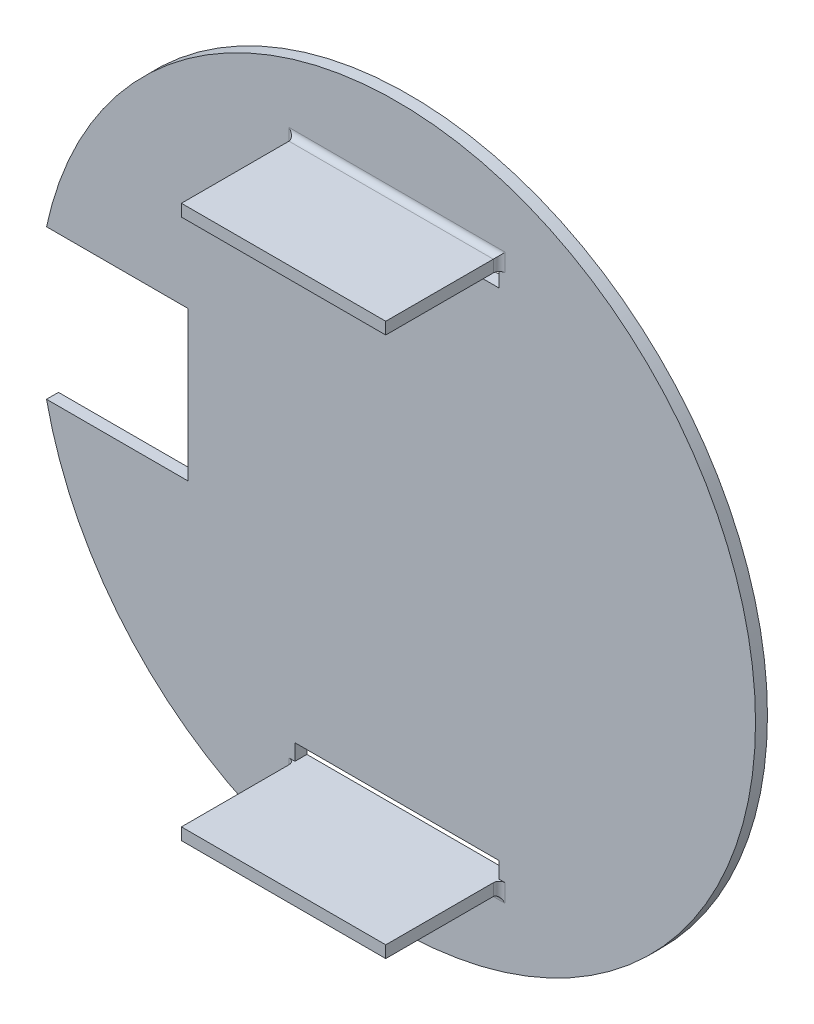
ISO-10303-21;
HEADER;
FILE_DESCRIPTION(('STEP AP214'),'2;1');
FILE_NAME('part.step','',(''),(''),'','','');
FILE_SCHEMA(('AUTOMOTIVE_DESIGN { 1 0 10303 214 1 1 1 1 }'));
ENDSEC;
DATA;
#1=APPLICATION_CONTEXT('core data for automotive mechanical design processes');
#2=APPLICATION_PROTOCOL_DEFINITION('international standard','automotive_design',2000,#1);
#3=PRODUCT_CONTEXT('',#1,'mechanical');
#4=PRODUCT('Part','Part','',(#3));
#5=PRODUCT_RELATED_PRODUCT_CATEGORY('part','',(#4));
#6=PRODUCT_DEFINITION_FORMATION('','',#4);
#7=PRODUCT_DEFINITION_CONTEXT('part definition',#1,'design');
#8=PRODUCT_DEFINITION('design','',#6,#7);
#9=PRODUCT_DEFINITION_SHAPE('','',#8);
#10=(LENGTH_UNIT() NAMED_UNIT(*) SI_UNIT(.MILLI.,.METRE.));
#11=(NAMED_UNIT(*) PLANE_ANGLE_UNIT() SI_UNIT($,.RADIAN.));
#12=(NAMED_UNIT(*) SI_UNIT($,.STERADIAN.) SOLID_ANGLE_UNIT());
#13=UNCERTAINTY_MEASURE_WITH_UNIT(LENGTH_MEASURE(1.E-05),#10,'distance_accuracy_value','');
#14=(GEOMETRIC_REPRESENTATION_CONTEXT(3) GLOBAL_UNCERTAINTY_ASSIGNED_CONTEXT((#13)) GLOBAL_UNIT_ASSIGNED_CONTEXT((#10,
#11,#12)) REPRESENTATION_CONTEXT('',''));
#15=CARTESIAN_POINT('',(0.,0.,0.));
#16=DIRECTION('',(0.,0.,1.));
#17=DIRECTION('',(1.,0.,0.));
#18=AXIS2_PLACEMENT_3D('',#15,#16,#17);
#19=CARTESIAN_POINT('',(0.,0.,2.));
#20=DIRECTION('',(0.,0.,1.));
#21=DIRECTION('',(1.,0.,0.));
#22=AXIS2_PLACEMENT_3D('',#19,#20,#21);
#23=PLANE('',#22);
#24=DIRECTION('',(0.,1.,0.));
#25=VECTOR('',#24,1.);
#26=CARTESIAN_POINT('',(18.1000000000001,0.,2.));
#27=LINE('',#26,#25);
#28=CARTESIAN_POINT('',(18.1,47.2,2.));
#29=VERTEX_POINT('',#28);
#30=CARTESIAN_POINT('',(18.1,44.2,2.));
#31=VERTEX_POINT('',#30);
#32=EDGE_CURVE('E394',#29,#31,#27,.F.);
#33=ORIENTED_EDGE('',*,*,#32,.T.);
#34=DIRECTION('',(-1.,0.,0.));
#35=VECTOR('',#34,1.);
#36=CARTESIAN_POINT('',(-17.1,44.2,2.));
#37=LINE('',#36,#35);
#38=CARTESIAN_POINT('',(17.1,44.2,2.));
#39=VERTEX_POINT('',#38);
#40=EDGE_CURVE('E403',#31,#39,#37,.T.);
#41=ORIENTED_EDGE('',*,*,#40,.T.);
#42=DIRECTION('',(0.,1.,0.));
#43=VECTOR('',#42,1.);
#44=CARTESIAN_POINT('',(17.1,44.2,2.));
#45=LINE('',#44,#43);
#46=CARTESIAN_POINT('',(17.1,41.5,2.));
#47=VERTEX_POINT('',#46);
#48=EDGE_CURVE('E314',#47,#39,#45,.T.);
#49=ORIENTED_EDGE('',*,*,#48,.F.);
#50=DIRECTION('',(1.,0.,0.));
#51=VECTOR('',#50,1.);
#52=CARTESIAN_POINT('',(-17.1,41.5,2.));
#53=LINE('',#52,#51);
#54=CARTESIAN_POINT('',(-17.1,41.5,2.));
#55=VERTEX_POINT('',#54);
#56=EDGE_CURVE('E310',#55,#47,#53,.T.);
#57=ORIENTED_EDGE('',*,*,#56,.F.);
#58=DIRECTION('',(0.,-1.,0.));
#59=VECTOR('',#58,1.);
#60=CARTESIAN_POINT('',(-17.1,44.2,2.));
#61=LINE('',#60,#59);
#62=CARTESIAN_POINT('',(-17.1,44.2,2.));
#63=VERTEX_POINT('',#62);
#64=EDGE_CURVE('E307',#63,#55,#61,.T.);
#65=ORIENTED_EDGE('',*,*,#64,.F.);
#66=DIRECTION('',(-1.,0.,0.));
#67=VECTOR('',#66,1.);
#68=CARTESIAN_POINT('',(-17.1,44.2,2.));
#69=LINE('',#68,#67);
#70=CARTESIAN_POINT('',(-18.1,44.2,2.));
#71=VERTEX_POINT('',#70);
#72=EDGE_CURVE('E57',#63,#71,#69,.T.);
#73=ORIENTED_EDGE('',*,*,#72,.T.);
#74=DIRECTION('',(0.,-1.,0.));
#75=VECTOR('',#74,1.);
#76=CARTESIAN_POINT('',(-18.1,0.,2.));
#77=LINE('',#76,#75);
#78=CARTESIAN_POINT('',(-18.1,47.2,2.));
#79=VERTEX_POINT('',#78);
#80=EDGE_CURVE('E398',#71,#79,#77,.F.);
#81=ORIENTED_EDGE('',*,*,#80,.T.);
#82=DIRECTION('',(-1.,0.,0.));
#83=VECTOR('',#82,1.);
#84=CARTESIAN_POINT('',(0.,47.2,2.));
#85=LINE('',#84,#83);
#86=EDGE_CURVE('E391',#79,#29,#85,.F.);
#87=ORIENTED_EDGE('',*,*,#86,.T.);
#88=EDGE_LOOP('',(#33,#41,#49,#57,#65,#73,#81,#87));
#89=FACE_BOUND('',#88,.T.);
#90=DIRECTION('',(0.,-1.,0.));
#91=VECTOR('',#90,1.);
#92=CARTESIAN_POINT('',(-35.,-12.5,2.));
#93=LINE('',#92,#91);
#94=CARTESIAN_POINT('',(-35.,12.5,2.));
#95=VERTEX_POINT('',#94);
#96=CARTESIAN_POINT('',(-35.,-12.5,2.));
#97=VERTEX_POINT('',#96);
#98=EDGE_CURVE('E346',#95,#97,#93,.T.);
#99=ORIENTED_EDGE('',*,*,#98,.T.);
#100=DIRECTION('',(-1.,0.,0.));
#101=VECTOR('',#100,1.);
#102=CARTESIAN_POINT('',(-58.6834729715275,-12.5,2.));
#103=LINE('',#102,#101);
#104=CARTESIAN_POINT('',(-58.6834729715275,-12.5,2.));
#105=VERTEX_POINT('',#104);
#106=EDGE_CURVE('E350',#97,#105,#103,.T.);
#107=ORIENTED_EDGE('',*,*,#106,.T.);
#108=CARTESIAN_POINT('',(0.,0.,2.));
#109=DIRECTION('',(0.,0.,1.));
#110=DIRECTION('',(1.,0.,0.));
#111=AXIS2_PLACEMENT_3D('',#108,#109,#110);
#112=CIRCLE('',#111,60.);
#113=CARTESIAN_POINT('',(-58.6834729715275,12.5,2.));
#114=VERTEX_POINT('',#113);
#115=EDGE_CURVE('E354',#105,#114,#112,.T.);
#116=ORIENTED_EDGE('',*,*,#115,.T.);
#117=DIRECTION('',(1.,0.,0.));
#118=VECTOR('',#117,1.);
#119=CARTESIAN_POINT('',(-58.6834729715275,12.5,2.));
#120=LINE('',#119,#118);
#121=EDGE_CURVE('E357',#114,#95,#120,.T.);
#122=ORIENTED_EDGE('',*,*,#121,.T.);
#123=EDGE_LOOP('',(#99,#107,#116,#122));
#124=FACE_BOUND('',#123,.T.);
#125=DIRECTION('',(0.,-1.,0.));
#126=VECTOR('',#125,1.);
#127=CARTESIAN_POINT('',(-18.1,0.,2.));
#128=LINE('',#127,#126);
#129=CARTESIAN_POINT('',(-18.1,-47.2,2.));
#130=VERTEX_POINT('',#129);
#131=CARTESIAN_POINT('',(-18.1,-44.2,2.));
#132=VERTEX_POINT('',#131);
#133=EDGE_CURVE('E409',#130,#132,#128,.F.);
#134=ORIENTED_EDGE('',*,*,#133,.T.);
#135=DIRECTION('',(1.,0.,0.));
#136=VECTOR('',#135,1.);
#137=CARTESIAN_POINT('',(-17.1,-44.2,2.));
#138=LINE('',#137,#136);
#139=CARTESIAN_POINT('',(-17.1,-44.2,2.));
#140=VERTEX_POINT('',#139);
#141=EDGE_CURVE('E418',#132,#140,#138,.T.);
#142=ORIENTED_EDGE('',*,*,#141,.T.);
#143=DIRECTION('',(0.,-1.,0.));
#144=VECTOR('',#143,1.);
#145=CARTESIAN_POINT('',(-17.1,-44.2,2.));
#146=LINE('',#145,#144);
#147=CARTESIAN_POINT('',(-17.1,-41.5,2.));
#148=VERTEX_POINT('',#147);
#149=EDGE_CURVE('E266',#148,#140,#146,.T.);
#150=ORIENTED_EDGE('',*,*,#149,.F.);
#151=DIRECTION('',(-1.,0.,0.));
#152=VECTOR('',#151,1.);
#153=CARTESIAN_POINT('',(-17.1,-41.5,2.));
#154=LINE('',#153,#152);
#155=CARTESIAN_POINT('',(17.1,-41.5,2.));
#156=VERTEX_POINT('',#155);
#157=EDGE_CURVE('E275',#156,#148,#154,.T.);
#158=ORIENTED_EDGE('',*,*,#157,.F.);
#159=DIRECTION('',(0.,1.,0.));
#160=VECTOR('',#159,1.);
#161=CARTESIAN_POINT('',(17.1,-44.2,2.));
#162=LINE('',#161,#160);
#163=CARTESIAN_POINT('',(17.1,-44.2,2.));
#164=VERTEX_POINT('',#163);
#165=EDGE_CURVE('E270',#164,#156,#162,.T.);
#166=ORIENTED_EDGE('',*,*,#165,.F.);
#167=DIRECTION('',(1.,0.,0.));
#168=VECTOR('',#167,1.);
#169=CARTESIAN_POINT('',(-17.1,-44.2,2.));
#170=LINE('',#169,#168);
#171=CARTESIAN_POINT('',(18.1,-44.2,2.));
#172=VERTEX_POINT('',#171);
#173=EDGE_CURVE('E65',#164,#172,#170,.T.);
#174=ORIENTED_EDGE('',*,*,#173,.T.);
#175=DIRECTION('',(0.,1.,0.));
#176=VECTOR('',#175,1.);
#177=CARTESIAN_POINT('',(18.1000000000001,0.,2.));
#178=LINE('',#177,#176);
#179=CARTESIAN_POINT('',(18.1,-47.2,2.));
#180=VERTEX_POINT('',#179);
#181=EDGE_CURVE('E413',#172,#180,#178,.F.);
#182=ORIENTED_EDGE('',*,*,#181,.T.);
#183=DIRECTION('',(1.,0.,0.));
#184=VECTOR('',#183,1.);
#185=CARTESIAN_POINT('',(0.,-47.2,2.));
#186=LINE('',#185,#184);
#187=EDGE_CURVE('E406',#180,#130,#186,.F.);
#188=ORIENTED_EDGE('',*,*,#187,.T.);
#189=EDGE_LOOP('',(#134,#142,#150,#158,#166,#174,#182,#188));
#190=FACE_BOUND('',#189,.T.);
#191=ADVANCED_FACE('F39',(#89,#124,#190),#23,.T.);
#192=CARTESIAN_POINT('',(0.,0.,0.));
#193=DIRECTION('',(0.,0.,1.));
#194=DIRECTION('',(1.,0.,0.));
#195=AXIS2_PLACEMENT_3D('',#192,#193,#194);
#196=PLANE('',#195);
#197=DIRECTION('',(0.,-1.,0.));
#198=VECTOR('',#197,1.);
#199=CARTESIAN_POINT('',(-17.1,44.2,0.));
#200=LINE('',#199,#198);
#201=CARTESIAN_POINT('',(-17.1,44.2,0.));
#202=VERTEX_POINT('',#201);
#203=CARTESIAN_POINT('',(-17.1,41.5,0.));
#204=VERTEX_POINT('',#203);
#205=EDGE_CURVE('E306',#202,#204,#200,.T.);
#206=ORIENTED_EDGE('',*,*,#205,.T.);
#207=DIRECTION('',(1.,0.,0.));
#208=VECTOR('',#207,1.);
#209=CARTESIAN_POINT('',(-17.1,41.5,0.));
#210=LINE('',#209,#208);
#211=CARTESIAN_POINT('',(17.1,41.5,0.));
#212=VERTEX_POINT('',#211);
#213=EDGE_CURVE('E322',#204,#212,#210,.T.);
#214=ORIENTED_EDGE('',*,*,#213,.T.);
#215=DIRECTION('',(0.,1.,0.));
#216=VECTOR('',#215,1.);
#217=CARTESIAN_POINT('',(17.1,44.2,0.));
#218=LINE('',#217,#216);
#219=CARTESIAN_POINT('',(17.1,44.2,0.));
#220=VERTEX_POINT('',#219);
#221=EDGE_CURVE('E326',#212,#220,#218,.T.);
#222=ORIENTED_EDGE('',*,*,#221,.T.);
#223=DIRECTION('',(-1.,0.,0.));
#224=VECTOR('',#223,1.);
#225=CARTESIAN_POINT('',(-17.1,44.2,0.));
#226=LINE('',#225,#224);
#227=EDGE_CURVE('E311',#220,#202,#226,.T.);
#228=ORIENTED_EDGE('',*,*,#227,.T.);
#229=EDGE_LOOP('',(#206,#214,#222,#228));
#230=FACE_BOUND('',#229,.T.);
#231=DIRECTION('',(0.,-1.,0.));
#232=VECTOR('',#231,1.);
#233=CARTESIAN_POINT('',(-35.,-12.5,0.));
#234=LINE('',#233,#232);
#235=CARTESIAN_POINT('',(-35.,12.5,0.));
#236=VERTEX_POINT('',#235);
#237=CARTESIAN_POINT('',(-35.,-12.5,0.));
#238=VERTEX_POINT('',#237);
#239=EDGE_CURVE('E345',#236,#238,#234,.T.);
#240=ORIENTED_EDGE('',*,*,#239,.F.);
#241=DIRECTION('',(1.,0.,0.));
#242=VECTOR('',#241,1.);
#243=CARTESIAN_POINT('',(-58.6834729715275,12.5,0.));
#244=LINE('',#243,#242);
#245=CARTESIAN_POINT('',(-58.6834729715275,12.5,0.));
#246=VERTEX_POINT('',#245);
#247=EDGE_CURVE('E351',#246,#236,#244,.T.);
#248=ORIENTED_EDGE('',*,*,#247,.F.);
#249=CARTESIAN_POINT('',(0.,0.,0.));
#250=DIRECTION('',(0.,0.,1.));
#251=DIRECTION('',(1.,0.,0.));
#252=AXIS2_PLACEMENT_3D('',#249,#250,#251);
#253=CIRCLE('',#252,60.);
#254=CARTESIAN_POINT('',(-58.6834729715275,-12.5,0.));
#255=VERTEX_POINT('',#254);
#256=EDGE_CURVE('E367',#255,#246,#253,.T.);
#257=ORIENTED_EDGE('',*,*,#256,.F.);
#258=DIRECTION('',(-1.,0.,0.));
#259=VECTOR('',#258,1.);
#260=CARTESIAN_POINT('',(-58.6834729715275,-12.5,0.));
#261=LINE('',#260,#259);
#262=EDGE_CURVE('E364',#238,#255,#261,.T.);
#263=ORIENTED_EDGE('',*,*,#262,.F.);
#264=EDGE_LOOP('',(#240,#248,#257,#263));
#265=FACE_BOUND('',#264,.T.);
#266=DIRECTION('',(0.,-1.,0.));
#267=VECTOR('',#266,1.);
#268=CARTESIAN_POINT('',(-17.1,-44.2,0.));
#269=LINE('',#268,#267);
#270=CARTESIAN_POINT('',(-17.1,-41.5,0.));
#271=VERTEX_POINT('',#270);
#272=CARTESIAN_POINT('',(-17.1,-44.2,0.));
#273=VERTEX_POINT('',#272);
#274=EDGE_CURVE('E265',#271,#273,#269,.T.);
#275=ORIENTED_EDGE('',*,*,#274,.T.);
#276=DIRECTION('',(1.,0.,0.));
#277=VECTOR('',#276,1.);
#278=CARTESIAN_POINT('',(-17.1,-44.2,0.));
#279=LINE('',#278,#277);
#280=CARTESIAN_POINT('',(17.1,-44.2,0.));
#281=VERTEX_POINT('',#280);
#282=EDGE_CURVE('E282',#273,#281,#279,.T.);
#283=ORIENTED_EDGE('',*,*,#282,.T.);
#284=DIRECTION('',(0.,1.,0.));
#285=VECTOR('',#284,1.);
#286=CARTESIAN_POINT('',(17.1,-44.2,0.));
#287=LINE('',#286,#285);
#288=CARTESIAN_POINT('',(17.1,-41.5,0.));
#289=VERTEX_POINT('',#288);
#290=EDGE_CURVE('E286',#281,#289,#287,.T.);
#291=ORIENTED_EDGE('',*,*,#290,.T.);
#292=DIRECTION('',(-1.,0.,0.));
#293=VECTOR('',#292,1.);
#294=CARTESIAN_POINT('',(-17.1,-41.5,0.));
#295=LINE('',#294,#293);
#296=EDGE_CURVE('E271',#289,#271,#295,.T.);
#297=ORIENTED_EDGE('',*,*,#296,.T.);
#298=EDGE_LOOP('',(#275,#283,#291,#297));
#299=FACE_BOUND('',#298,.T.);
#300=ADVANCED_FACE('F500',(#230,#265,#299),#196,.F.);
#301=CARTESIAN_POINT('',(-35.,-12.5,2.));
#302=DIRECTION('',(1.,0.,0.));
#303=DIRECTION('',(0.,0.,-1.));
#304=AXIS2_PLACEMENT_3D('',#301,#302,#303);
#305=PLANE('',#304);
#306=ORIENTED_EDGE('',*,*,#239,.T.);
#307=DIRECTION('',(0.,0.,-1.));
#308=VECTOR('',#307,1.);
#309=CARTESIAN_POINT('',(-35.,-12.5,2.));
#310=LINE('',#309,#308);
#311=EDGE_CURVE('E383',#97,#238,#310,.T.);
#312=ORIENTED_EDGE('',*,*,#311,.F.);
#313=ORIENTED_EDGE('',*,*,#98,.F.);
#314=DIRECTION('',(0.,0.,-1.));
#315=VECTOR('',#314,1.);
#316=CARTESIAN_POINT('',(-35.,12.5,2.));
#317=LINE('',#316,#315);
#318=EDGE_CURVE('E360',#95,#236,#317,.T.);
#319=ORIENTED_EDGE('',*,*,#318,.T.);
#320=EDGE_LOOP('',(#306,#312,#313,#319));
#321=FACE_BOUND('',#320,.T.);
#322=ADVANCED_FACE('F505',(#321),#305,.F.);
#323=CARTESIAN_POINT('',(-58.6834729715275,-12.5,2.));
#324=DIRECTION('',(0.,-1.,0.));
#325=DIRECTION('',(0.,0.,-1.));
#326=AXIS2_PLACEMENT_3D('',#323,#324,#325);
#327=PLANE('',#326);
#328=ORIENTED_EDGE('',*,*,#262,.T.);
#329=DIRECTION('',(0.,0.,-1.));
#330=VECTOR('',#329,1.);
#331=CARTESIAN_POINT('',(-58.6834729715275,-12.5,2.));
#332=LINE('',#331,#330);
#333=EDGE_CURVE('E379',#105,#255,#332,.T.);
#334=ORIENTED_EDGE('',*,*,#333,.F.);
#335=ORIENTED_EDGE('',*,*,#106,.F.);
#336=ORIENTED_EDGE('',*,*,#311,.T.);
#337=EDGE_LOOP('',(#328,#334,#335,#336));
#338=FACE_BOUND('',#337,.T.);
#339=ADVANCED_FACE('F519',(#338),#327,.F.);
#340=CARTESIAN_POINT('',(0.,0.,2.));
#341=DIRECTION('',(0.,0.,-1.));
#342=DIRECTION('',(-1.,0.,0.));
#343=AXIS2_PLACEMENT_3D('',#340,#341,#342);
#344=CYLINDRICAL_SURFACE('',#343,60.);
#345=ORIENTED_EDGE('',*,*,#256,.T.);
#346=DIRECTION('',(0.,0.,-1.));
#347=VECTOR('',#346,1.);
#348=CARTESIAN_POINT('',(-58.6834729715275,12.5,2.));
#349=LINE('',#348,#347);
#350=EDGE_CURVE('E375',#114,#246,#349,.T.);
#351=ORIENTED_EDGE('',*,*,#350,.F.);
#352=ORIENTED_EDGE('',*,*,#115,.F.);
#353=ORIENTED_EDGE('',*,*,#333,.T.);
#354=EDGE_LOOP('',(#345,#351,#352,#353));
#355=FACE_BOUND('',#354,.T.);
#356=ADVANCED_FACE('F515',(#355),#344,.T.);
#357=CARTESIAN_POINT('',(-58.6834729715275,12.5,2.));
#358=DIRECTION('',(0.,1.,0.));
#359=DIRECTION('',(0.,0.,1.));
#360=AXIS2_PLACEMENT_3D('',#357,#358,#359);
#361=PLANE('',#360);
#362=ORIENTED_EDGE('',*,*,#247,.T.);
#363=ORIENTED_EDGE('',*,*,#318,.F.);
#364=ORIENTED_EDGE('',*,*,#121,.F.);
#365=ORIENTED_EDGE('',*,*,#350,.T.);
#366=EDGE_LOOP('',(#362,#363,#364,#365));
#367=FACE_BOUND('',#366,.T.);
#368=ADVANCED_FACE('F512',(#367),#361,.F.);
#369=CARTESIAN_POINT('',(-17.1,44.2,2.));
#370=DIRECTION('',(1.,0.,0.));
#371=DIRECTION('',(0.,1.,0.));
#372=AXIS2_PLACEMENT_3D('',#369,#370,#371);
#373=PLANE('',#372);
#374=ORIENTED_EDGE('',*,*,#205,.F.);
#375=DIRECTION('',(0.,0.,-1.));
#376=VECTOR('',#375,1.);
#377=CARTESIAN_POINT('',(-17.1,44.2,2.));
#378=LINE('',#377,#376);
#379=EDGE_CURVE('E318',#63,#202,#378,.T.);
#380=ORIENTED_EDGE('',*,*,#379,.F.);
#381=ORIENTED_EDGE('',*,*,#64,.T.);
#382=DIRECTION('',(0.,0.,-1.));
#383=VECTOR('',#382,1.);
#384=CARTESIAN_POINT('',(-17.1,41.5,2.));
#385=LINE('',#384,#383);
#386=EDGE_CURVE('E341',#55,#204,#385,.T.);
#387=ORIENTED_EDGE('',*,*,#386,.T.);
#388=EDGE_LOOP('',(#374,#380,#381,#387));
#389=FACE_BOUND('',#388,.T.);
#390=ADVANCED_FACE('F509',(#389),#373,.T.);
#391=CARTESIAN_POINT('',(-17.1,41.5,2.));
#392=DIRECTION('',(0.,1.,0.));
#393=DIRECTION('',(0.,0.,1.));
#394=AXIS2_PLACEMENT_3D('',#391,#392,#393);
#395=PLANE('',#394);
#396=ORIENTED_EDGE('',*,*,#213,.F.);
#397=ORIENTED_EDGE('',*,*,#386,.F.);
#398=ORIENTED_EDGE('',*,*,#56,.T.);
#399=DIRECTION('',(0.,0.,-1.));
#400=VECTOR('',#399,1.);
#401=CARTESIAN_POINT('',(17.1,41.5,2.));
#402=LINE('',#401,#400);
#403=EDGE_CURVE('E338',#47,#212,#402,.T.);
#404=ORIENTED_EDGE('',*,*,#403,.T.);
#405=EDGE_LOOP('',(#396,#397,#398,#404));
#406=FACE_BOUND('',#405,.T.);
#407=ADVANCED_FACE('F671',(#406),#395,.T.);
#408=CARTESIAN_POINT('',(17.1,44.2,2.));
#409=DIRECTION('',(-1.,0.,0.));
#410=DIRECTION('',(0.,-1.,0.));
#411=AXIS2_PLACEMENT_3D('',#408,#409,#410);
#412=PLANE('',#411);
#413=ORIENTED_EDGE('',*,*,#221,.F.);
#414=ORIENTED_EDGE('',*,*,#403,.F.);
#415=ORIENTED_EDGE('',*,*,#48,.T.);
#416=DIRECTION('',(0.,0.,-1.));
#417=VECTOR('',#416,1.);
#418=CARTESIAN_POINT('',(17.1,44.2,2.));
#419=LINE('',#418,#417);
#420=EDGE_CURVE('E335',#39,#220,#419,.T.);
#421=ORIENTED_EDGE('',*,*,#420,.T.);
#422=EDGE_LOOP('',(#413,#414,#415,#421));
#423=FACE_BOUND('',#422,.T.);
#424=ADVANCED_FACE('F629',(#423),#412,.T.);
#425=CARTESIAN_POINT('',(-17.1,44.2,2.));
#426=DIRECTION('',(0.,-1.,0.));
#427=DIRECTION('',(1.,0.,0.));
#428=AXIS2_PLACEMENT_3D('',#425,#426,#427);
#429=PLANE('',#428);
#430=ORIENTED_EDGE('',*,*,#227,.F.);
#431=ORIENTED_EDGE('',*,*,#420,.F.);
#432=ORIENTED_EDGE('',*,*,#40,.F.);
#433=CARTESIAN_POINT('',(18.1,44.2,3.));
#434=DIRECTION('',(0.,-1.,0.));
#435=DIRECTION('',(1.,0.,0.));
#436=AXIS2_PLACEMENT_3D('',#433,#434,#435);
#437=CIRCLE('',#436,1.);
#438=CARTESIAN_POINT('',(17.1,44.2,3.));
#439=VERTEX_POINT('',#438);
#440=EDGE_CURVE('E11',#31,#439,#437,.F.);
#441=ORIENTED_EDGE('',*,*,#440,.T.);
#442=DIRECTION('',(0.,0.,-1.));
#443=VECTOR('',#442,1.);
#444=CARTESIAN_POINT('',(17.1,44.2,21.));
#445=LINE('',#444,#443);
#446=CARTESIAN_POINT('',(17.1,44.2,21.));
#447=VERTEX_POINT('',#446);
#448=EDGE_CURVE('E257',#447,#439,#445,.T.);
#449=ORIENTED_EDGE('',*,*,#448,.F.);
#450=DIRECTION('',(1.,0.,0.));
#451=VECTOR('',#450,1.);
#452=CARTESIAN_POINT('',(-17.1,44.2,21.));
#453=LINE('',#452,#451);
#454=CARTESIAN_POINT('',(-17.1,44.2,21.));
#455=VERTEX_POINT('',#454);
#456=EDGE_CURVE('E235',#455,#447,#453,.T.);
#457=ORIENTED_EDGE('',*,*,#456,.F.);
#458=DIRECTION('',(0.,0.,-1.));
#459=VECTOR('',#458,1.);
#460=CARTESIAN_POINT('',(-17.1,44.2,21.));
#461=LINE('',#460,#459);
#462=CARTESIAN_POINT('',(-17.1,44.2,3.));
#463=VERTEX_POINT('',#462);
#464=EDGE_CURVE('E261',#455,#463,#461,.T.);
#465=ORIENTED_EDGE('',*,*,#464,.T.);
#466=CARTESIAN_POINT('',(-18.1,44.2,3.));
#467=DIRECTION('',(0.,-1.,0.));
#468=DIRECTION('',(1.,0.,0.));
#469=AXIS2_PLACEMENT_3D('',#466,#467,#468);
#470=CIRCLE('',#469,1.);
#471=EDGE_CURVE('E49',#463,#71,#470,.F.);
#472=ORIENTED_EDGE('',*,*,#471,.T.);
#473=ORIENTED_EDGE('',*,*,#72,.F.);
#474=ORIENTED_EDGE('',*,*,#379,.T.);
#475=EDGE_LOOP('',(#430,#431,#432,#441,#449,#457,#465,#472,#473,#474));
#476=FACE_BOUND('',#475,.T.);
#477=ADVANCED_FACE('F479',(#476),#429,.T.);
#478=CARTESIAN_POINT('',(-17.1,-44.2,2.));
#479=DIRECTION('',(1.,0.,0.));
#480=DIRECTION('',(0.,1.,0.));
#481=AXIS2_PLACEMENT_3D('',#478,#479,#480);
#482=PLANE('',#481);
#483=ORIENTED_EDGE('',*,*,#274,.F.);
#484=DIRECTION('',(0.,0.,-1.));
#485=VECTOR('',#484,1.);
#486=CARTESIAN_POINT('',(-17.1,-41.5,2.));
#487=LINE('',#486,#485);
#488=EDGE_CURVE('E278',#148,#271,#487,.T.);
#489=ORIENTED_EDGE('',*,*,#488,.F.);
#490=ORIENTED_EDGE('',*,*,#149,.T.);
#491=DIRECTION('',(0.,0.,-1.));
#492=VECTOR('',#491,1.);
#493=CARTESIAN_POINT('',(-17.1,-44.2,2.));
#494=LINE('',#493,#492);
#495=EDGE_CURVE('E302',#140,#273,#494,.T.);
#496=ORIENTED_EDGE('',*,*,#495,.T.);
#497=EDGE_LOOP('',(#483,#489,#490,#496));
#498=FACE_BOUND('',#497,.T.);
#499=ADVANCED_FACE('F618',(#498),#482,.T.);
#500=CARTESIAN_POINT('',(-17.1,-44.2,2.));
#501=DIRECTION('',(0.,1.,0.));
#502=DIRECTION('',(-1.,0.,0.));
#503=AXIS2_PLACEMENT_3D('',#500,#501,#502);
#504=PLANE('',#503);
#505=ORIENTED_EDGE('',*,*,#282,.F.);
#506=ORIENTED_EDGE('',*,*,#495,.F.);
#507=ORIENTED_EDGE('',*,*,#141,.F.);
#508=CARTESIAN_POINT('',(-18.1,-44.2,3.));
#509=DIRECTION('',(0.,1.,0.));
#510=DIRECTION('',(-1.,0.,0.));
#511=AXIS2_PLACEMENT_3D('',#508,#509,#510);
#512=CIRCLE('',#511,1.);
#513=CARTESIAN_POINT('',(-17.1,-44.2,3.));
#514=VERTEX_POINT('',#513);
#515=EDGE_CURVE('E228',#132,#514,#512,.F.);
#516=ORIENTED_EDGE('',*,*,#515,.T.);
#517=DIRECTION('',(0.,0.,-1.));
#518=VECTOR('',#517,1.);
#519=CARTESIAN_POINT('',(-17.1,-44.2,21.));
#520=LINE('',#519,#518);
#521=CARTESIAN_POINT('',(-17.1,-44.2,21.));
#522=VERTEX_POINT('',#521);
#523=EDGE_CURVE('E207',#522,#514,#520,.T.);
#524=ORIENTED_EDGE('',*,*,#523,.F.);
#525=DIRECTION('',(-1.,0.,0.));
#526=VECTOR('',#525,1.);
#527=CARTESIAN_POINT('',(-17.1,-44.2,21.));
#528=LINE('',#527,#526);
#529=CARTESIAN_POINT('',(17.1,-44.2,21.));
#530=VERTEX_POINT('',#529);
#531=EDGE_CURVE('E215',#530,#522,#528,.T.);
#532=ORIENTED_EDGE('',*,*,#531,.F.);
#533=DIRECTION('',(0.,0.,-1.));
#534=VECTOR('',#533,1.);
#535=CARTESIAN_POINT('',(17.1,-44.2,21.));
#536=LINE('',#535,#534);
#537=CARTESIAN_POINT('',(17.1,-44.2,3.));
#538=VERTEX_POINT('',#537);
#539=EDGE_CURVE('E745',#530,#538,#536,.T.);
#540=ORIENTED_EDGE('',*,*,#539,.T.);
#541=CARTESIAN_POINT('',(18.1,-44.2,3.));
#542=DIRECTION('',(0.,1.,0.));
#543=DIRECTION('',(-1.,0.,0.));
#544=AXIS2_PLACEMENT_3D('',#541,#542,#543);
#545=CIRCLE('',#544,1.);
#546=EDGE_CURVE('E437',#538,#172,#545,.F.);
#547=ORIENTED_EDGE('',*,*,#546,.T.);
#548=ORIENTED_EDGE('',*,*,#173,.F.);
#549=DIRECTION('',(0.,0.,-1.));
#550=VECTOR('',#549,1.);
#551=CARTESIAN_POINT('',(17.1,-44.2,2.));
#552=LINE('',#551,#550);
#553=EDGE_CURVE('E299',#164,#281,#552,.T.);
#554=ORIENTED_EDGE('',*,*,#553,.T.);
#555=EDGE_LOOP('',(#505,#506,#507,#516,#524,#532,#540,#547,#548,#554));
#556=FACE_BOUND('',#555,.T.);
#557=ADVANCED_FACE('F226',(#556),#504,.T.);
#558=CARTESIAN_POINT('',(17.1,-44.2,2.));
#559=DIRECTION('',(-1.,0.,0.));
#560=DIRECTION('',(0.,-1.,0.));
#561=AXIS2_PLACEMENT_3D('',#558,#559,#560);
#562=PLANE('',#561);
#563=ORIENTED_EDGE('',*,*,#290,.F.);
#564=ORIENTED_EDGE('',*,*,#553,.F.);
#565=ORIENTED_EDGE('',*,*,#165,.T.);
#566=DIRECTION('',(0.,0.,-1.));
#567=VECTOR('',#566,1.);
#568=CARTESIAN_POINT('',(17.1,-41.5,2.));
#569=LINE('',#568,#567);
#570=EDGE_CURVE('E296',#156,#289,#569,.T.);
#571=ORIENTED_EDGE('',*,*,#570,.T.);
#572=EDGE_LOOP('',(#563,#564,#565,#571));
#573=FACE_BOUND('',#572,.T.);
#574=ADVANCED_FACE('F617',(#573),#562,.T.);
#575=CARTESIAN_POINT('',(-17.1,-41.5,2.));
#576=DIRECTION('',(0.,-1.,0.));
#577=DIRECTION('',(0.,0.,-1.));
#578=AXIS2_PLACEMENT_3D('',#575,#576,#577);
#579=PLANE('',#578);
#580=ORIENTED_EDGE('',*,*,#296,.F.);
#581=ORIENTED_EDGE('',*,*,#570,.F.);
#582=ORIENTED_EDGE('',*,*,#157,.T.);
#583=ORIENTED_EDGE('',*,*,#488,.T.);
#584=EDGE_LOOP('',(#580,#581,#582,#583));
#585=FACE_BOUND('',#584,.T.);
#586=ADVANCED_FACE('F497',(#585),#579,.T.);
#587=CARTESIAN_POINT('',(-17.1,44.2,21.));
#588=DIRECTION('',(1.,0.,0.));
#589=DIRECTION('',(0.,0.,-1.));
#590=AXIS2_PLACEMENT_3D('',#587,#588,#589);
#591=PLANE('',#590);
#592=DIRECTION('',(0.,0.,-1.));
#593=VECTOR('',#592,1.);
#594=CARTESIAN_POINT('',(-17.1,46.2,21.));
#595=LINE('',#594,#593);
#596=CARTESIAN_POINT('',(-17.1,46.2,21.));
#597=VERTEX_POINT('',#596);
#598=CARTESIAN_POINT('',(-17.1,46.2,3.));
#599=VERTEX_POINT('',#598);
#600=EDGE_CURVE('E249',#597,#599,#595,.T.);
#601=ORIENTED_EDGE('',*,*,#600,.T.);
#602=DIRECTION('',(0.,-1.,0.));
#603=VECTOR('',#602,1.);
#604=CARTESIAN_POINT('',(-17.1,44.2,3.));
#605=LINE('',#604,#603);
#606=EDGE_CURVE('E427',#599,#463,#605,.T.);
#607=ORIENTED_EDGE('',*,*,#606,.T.);
#608=ORIENTED_EDGE('',*,*,#464,.F.);
#609=DIRECTION('',(0.,-1.,0.));
#610=VECTOR('',#609,1.);
#611=CARTESIAN_POINT('',(-17.1,44.2,21.));
#612=LINE('',#611,#610);
#613=EDGE_CURVE('E230',#597,#455,#612,.T.);
#614=ORIENTED_EDGE('',*,*,#613,.F.);
#615=EDGE_LOOP('',(#601,#607,#608,#614));
#616=FACE_BOUND('',#615,.T.);
#617=ADVANCED_FACE('F475',(#616),#591,.F.);
#618=CARTESIAN_POINT('',(17.1,44.2,21.));
#619=DIRECTION('',(-1.,0.,0.));
#620=DIRECTION('',(0.,-1.,0.));
#621=AXIS2_PLACEMENT_3D('',#618,#619,#620);
#622=PLANE('',#621);
#623=ORIENTED_EDGE('',*,*,#448,.T.);
#624=DIRECTION('',(0.,1.,0.));
#625=VECTOR('',#624,1.);
#626=CARTESIAN_POINT('',(17.1,44.2,3.));
#627=LINE('',#626,#625);
#628=CARTESIAN_POINT('',(17.1,46.2,3.));
#629=VERTEX_POINT('',#628);
#630=EDGE_CURVE('E431',#439,#629,#627,.T.);
#631=ORIENTED_EDGE('',*,*,#630,.T.);
#632=DIRECTION('',(0.,0.,-1.));
#633=VECTOR('',#632,1.);
#634=CARTESIAN_POINT('',(17.1,46.2,21.));
#635=LINE('',#634,#633);
#636=CARTESIAN_POINT('',(17.1,46.2,21.));
#637=VERTEX_POINT('',#636);
#638=EDGE_CURVE('E253',#637,#629,#635,.T.);
#639=ORIENTED_EDGE('',*,*,#638,.F.);
#640=DIRECTION('',(0.,1.,0.));
#641=VECTOR('',#640,1.);
#642=CARTESIAN_POINT('',(17.1,44.2,21.));
#643=LINE('',#642,#641);
#644=EDGE_CURVE('E243',#447,#637,#643,.T.);
#645=ORIENTED_EDGE('',*,*,#644,.F.);
#646=EDGE_LOOP('',(#623,#631,#639,#645));
#647=FACE_BOUND('',#646,.T.);
#648=ADVANCED_FACE('F489',(#647),#622,.F.);
#649=CARTESIAN_POINT('',(-17.1,46.2,21.));
#650=DIRECTION('',(0.,-1.,0.));
#651=DIRECTION('',(0.,0.,-1.));
#652=AXIS2_PLACEMENT_3D('',#649,#650,#651);
#653=PLANE('',#652);
#654=ORIENTED_EDGE('',*,*,#638,.T.);
#655=DIRECTION('',(-1.,0.,0.));
#656=VECTOR('',#655,1.);
#657=CARTESIAN_POINT('',(-17.1,46.2,3.));
#658=LINE('',#657,#656);
#659=EDGE_CURVE('E434',#629,#599,#658,.T.);
#660=ORIENTED_EDGE('',*,*,#659,.T.);
#661=ORIENTED_EDGE('',*,*,#600,.F.);
#662=DIRECTION('',(-1.,0.,0.));
#663=VECTOR('',#662,1.);
#664=CARTESIAN_POINT('',(-17.1,46.2,21.));
#665=LINE('',#664,#663);
#666=EDGE_CURVE('E246',#637,#597,#665,.T.);
#667=ORIENTED_EDGE('',*,*,#666,.F.);
#668=EDGE_LOOP('',(#654,#660,#661,#667));
#669=FACE_BOUND('',#668,.T.);
#670=ADVANCED_FACE('F487',(#669),#653,.F.);
#671=CARTESIAN_POINT('',(0.,0.,21.));
#672=DIRECTION('',(0.,0.,-1.));
#673=DIRECTION('',(-1.,0.,0.));
#674=AXIS2_PLACEMENT_3D('',#671,#672,#673);
#675=PLANE('',#674);
#676=ORIENTED_EDGE('',*,*,#613,.T.);
#677=ORIENTED_EDGE('',*,*,#456,.T.);
#678=ORIENTED_EDGE('',*,*,#644,.T.);
#679=ORIENTED_EDGE('',*,*,#666,.T.);
#680=EDGE_LOOP('',(#676,#677,#678,#679));
#681=FACE_BOUND('',#680,.T.);
#682=ADVANCED_FACE('F483',(#681),#675,.F.);
#683=CARTESIAN_POINT('',(-17.1,-44.2,21.));
#684=DIRECTION('',(1.,0.,0.));
#685=DIRECTION('',(0.,0.,-1.));
#686=AXIS2_PLACEMENT_3D('',#683,#684,#685);
#687=PLANE('',#686);
#688=ORIENTED_EDGE('',*,*,#523,.T.);
#689=DIRECTION('',(0.,-1.,0.));
#690=VECTOR('',#689,1.);
#691=CARTESIAN_POINT('',(-17.1,-44.2,3.));
#692=LINE('',#691,#690);
#693=CARTESIAN_POINT('',(-17.1,-46.2,3.));
#694=VERTEX_POINT('',#693);
#695=EDGE_CURVE('E421',#514,#694,#692,.T.);
#696=ORIENTED_EDGE('',*,*,#695,.T.);
#697=DIRECTION('',(0.,0.,-1.));
#698=VECTOR('',#697,1.);
#699=CARTESIAN_POINT('',(-17.1,-46.2,21.));
#700=LINE('',#699,#698);
#701=CARTESIAN_POINT('',(-17.1,-46.2,21.));
#702=VERTEX_POINT('',#701);
#703=EDGE_CURVE('E210',#702,#694,#700,.T.);
#704=ORIENTED_EDGE('',*,*,#703,.F.);
#705=DIRECTION('',(0.,-1.,0.));
#706=VECTOR('',#705,1.);
#707=CARTESIAN_POINT('',(-17.1,-44.2,21.));
#708=LINE('',#707,#706);
#709=EDGE_CURVE('E203',#522,#702,#708,.T.);
#710=ORIENTED_EDGE('',*,*,#709,.F.);
#711=EDGE_LOOP('',(#688,#696,#704,#710));
#712=FACE_BOUND('',#711,.T.);
#713=ADVANCED_FACE('F205',(#712),#687,.F.);
#714=CARTESIAN_POINT('',(-17.1,-46.2,21.));
#715=DIRECTION('',(0.,1.,0.));
#716=DIRECTION('',(0.,0.,1.));
#717=AXIS2_PLACEMENT_3D('',#714,#715,#716);
#718=PLANE('',#717);
#719=ORIENTED_EDGE('',*,*,#703,.T.);
#720=DIRECTION('',(1.,0.,0.));
#721=VECTOR('',#720,1.);
#722=CARTESIAN_POINT('',(-17.1,-46.2,3.));
#723=LINE('',#722,#721);
#724=CARTESIAN_POINT('',(17.1,-46.2,3.));
#725=VERTEX_POINT('',#724);
#726=EDGE_CURVE('E424',#694,#725,#723,.T.);
#727=ORIENTED_EDGE('',*,*,#726,.T.);
#728=DIRECTION('',(0.,0.,-1.));
#729=VECTOR('',#728,1.);
#730=CARTESIAN_POINT('',(17.1,-46.2,21.));
#731=LINE('',#730,#729);
#732=CARTESIAN_POINT('',(17.1,-46.2,21.));
#733=VERTEX_POINT('',#732);
#734=EDGE_CURVE('E237',#733,#725,#731,.T.);
#735=ORIENTED_EDGE('',*,*,#734,.F.);
#736=DIRECTION('',(1.,0.,0.));
#737=VECTOR('',#736,1.);
#738=CARTESIAN_POINT('',(-17.1,-46.2,21.));
#739=LINE('',#738,#737);
#740=EDGE_CURVE('E214',#702,#733,#739,.T.);
#741=ORIENTED_EDGE('',*,*,#740,.F.);
#742=EDGE_LOOP('',(#719,#727,#735,#741));
#743=FACE_BOUND('',#742,.T.);
#744=ADVANCED_FACE('F572',(#743),#718,.F.);
#745=CARTESIAN_POINT('',(17.1,-44.2,21.));
#746=DIRECTION('',(-1.,0.,0.));
#747=DIRECTION('',(0.,-1.,0.));
#748=AXIS2_PLACEMENT_3D('',#745,#746,#747);
#749=PLANE('',#748);
#750=ORIENTED_EDGE('',*,*,#734,.T.);
#751=DIRECTION('',(0.,1.,0.));
#752=VECTOR('',#751,1.);
#753=CARTESIAN_POINT('',(17.1,-44.2,3.));
#754=LINE('',#753,#752);
#755=EDGE_CURVE('E387',#725,#538,#754,.T.);
#756=ORIENTED_EDGE('',*,*,#755,.T.);
#757=ORIENTED_EDGE('',*,*,#539,.F.);
#758=DIRECTION('',(0.,1.,0.));
#759=VECTOR('',#758,1.);
#760=CARTESIAN_POINT('',(17.1,-44.2,21.));
#761=LINE('',#760,#759);
#762=EDGE_CURVE('E220',#733,#530,#761,.T.);
#763=ORIENTED_EDGE('',*,*,#762,.F.);
#764=EDGE_LOOP('',(#750,#756,#757,#763));
#765=FACE_BOUND('',#764,.T.);
#766=ADVANCED_FACE('F565',(#765),#749,.F.);
#767=CARTESIAN_POINT('',(0.,0.,21.));
#768=DIRECTION('',(0.,0.,-1.));
#769=DIRECTION('',(-1.,0.,0.));
#770=AXIS2_PLACEMENT_3D('',#767,#768,#769);
#771=PLANE('',#770);
#772=ORIENTED_EDGE('',*,*,#531,.T.);
#773=ORIENTED_EDGE('',*,*,#709,.T.);
#774=ORIENTED_EDGE('',*,*,#740,.T.);
#775=ORIENTED_EDGE('',*,*,#762,.T.);
#776=EDGE_LOOP('',(#772,#773,#774,#775));
#777=FACE_BOUND('',#776,.T.);
#778=ADVANCED_FACE('F218',(#777),#771,.F.);
#779=CARTESIAN_POINT('',(-18.1,-44.2,3.));
#780=DIRECTION('',(0.,-1.,0.));
#781=DIRECTION('',(0.,0.,-1.));
#782=AXIS2_PLACEMENT_3D('',#779,#780,#781);
#783=CYLINDRICAL_SURFACE('',#782,1.);
#784=ORIENTED_EDGE('',*,*,#515,.F.);
#785=ORIENTED_EDGE('',*,*,#133,.F.);
#786=CARTESIAN_POINT('',(-18.1,-47.2,3.));
#787=DIRECTION('',(0.707106781186547,-0.707106781186547,0.));
#788=DIRECTION('',(0.707106781186547,0.707106781186547,0.));
#789=AXIS2_PLACEMENT_3D('',#786,#787,#788);
#790=ELLIPSE('',#789,1.41421356237309,1.);
#791=EDGE_CURVE('E224',#694,#130,#790,.F.);
#792=ORIENTED_EDGE('',*,*,#791,.F.);
#793=ORIENTED_EDGE('',*,*,#695,.F.);
#794=EDGE_LOOP('',(#784,#785,#792,#793));
#795=FACE_BOUND('',#794,.T.);
#796=ADVANCED_FACE('F534',(#795),#783,.F.);
#797=CARTESIAN_POINT('',(-17.1,-47.2,3.));
#798=DIRECTION('',(1.,0.,0.));
#799=DIRECTION('',(0.,0.,-1.));
#800=AXIS2_PLACEMENT_3D('',#797,#798,#799);
#801=CYLINDRICAL_SURFACE('',#800,1.);
#802=ORIENTED_EDGE('',*,*,#791,.T.);
#803=ORIENTED_EDGE('',*,*,#187,.F.);
#804=CARTESIAN_POINT('',(18.1,-47.2,3.));
#805=DIRECTION('',(0.707106781186548,0.707106781186547,0.));
#806=DIRECTION('',(0.707106781186547,-0.707106781186548,0.));
#807=AXIS2_PLACEMENT_3D('',#804,#805,#806);
#808=ELLIPSE('',#807,1.41421356237309,1.);
#809=EDGE_CURVE('E444',#725,#180,#808,.F.);
#810=ORIENTED_EDGE('',*,*,#809,.F.);
#811=ORIENTED_EDGE('',*,*,#726,.F.);
#812=EDGE_LOOP('',(#802,#803,#810,#811));
#813=FACE_BOUND('',#812,.T.);
#814=ADVANCED_FACE('F530',(#813),#801,.F.);
#815=CARTESIAN_POINT('',(18.1,-44.2,3.));
#816=DIRECTION('',(0.,1.,0.));
#817=DIRECTION('',(-1.,0.,0.));
#818=AXIS2_PLACEMENT_3D('',#815,#816,#817);
#819=CYLINDRICAL_SURFACE('',#818,1.);
#820=ORIENTED_EDGE('',*,*,#809,.T.);
#821=ORIENTED_EDGE('',*,*,#181,.F.);
#822=ORIENTED_EDGE('',*,*,#546,.F.);
#823=ORIENTED_EDGE('',*,*,#755,.F.);
#824=EDGE_LOOP('',(#820,#821,#822,#823));
#825=FACE_BOUND('',#824,.T.);
#826=ADVANCED_FACE('F527',(#825),#819,.F.);
#827=CARTESIAN_POINT('',(18.1,44.2,3.));
#828=DIRECTION('',(0.,1.,0.));
#829=DIRECTION('',(-1.,0.,0.));
#830=AXIS2_PLACEMENT_3D('',#827,#828,#829);
#831=CYLINDRICAL_SURFACE('',#830,1.);
#832=ORIENTED_EDGE('',*,*,#440,.F.);
#833=ORIENTED_EDGE('',*,*,#32,.F.);
#834=CARTESIAN_POINT('',(18.1,47.2,3.));
#835=DIRECTION('',(-0.707106781186548,0.707106781186547,0.));
#836=DIRECTION('',(-0.707106781186547,-0.707106781186548,0.));
#837=AXIS2_PLACEMENT_3D('',#834,#835,#836);
#838=ELLIPSE('',#837,1.41421356237309,1.);
#839=EDGE_CURVE('E43',#629,#29,#838,.F.);
#840=ORIENTED_EDGE('',*,*,#839,.F.);
#841=ORIENTED_EDGE('',*,*,#630,.F.);
#842=EDGE_LOOP('',(#832,#833,#840,#841));
#843=FACE_BOUND('',#842,.T.);
#844=ADVANCED_FACE('F41',(#843),#831,.F.);
#845=CARTESIAN_POINT('',(-17.1,47.2,3.));
#846=DIRECTION('',(-1.,0.,0.));
#847=DIRECTION('',(0.,0.,1.));
#848=AXIS2_PLACEMENT_3D('',#845,#846,#847);
#849=CYLINDRICAL_SURFACE('',#848,1.);
#850=ORIENTED_EDGE('',*,*,#839,.T.);
#851=ORIENTED_EDGE('',*,*,#86,.F.);
#852=CARTESIAN_POINT('',(-18.1,47.2,3.));
#853=DIRECTION('',(-0.707106781186547,-0.707106781186547,0.));
#854=DIRECTION('',(-0.707106781186547,0.707106781186547,0.));
#855=AXIS2_PLACEMENT_3D('',#852,#853,#854);
#856=ELLIPSE('',#855,1.41421356237309,1.);
#857=EDGE_CURVE('E450',#599,#79,#856,.F.);
#858=ORIENTED_EDGE('',*,*,#857,.F.);
#859=ORIENTED_EDGE('',*,*,#659,.F.);
#860=EDGE_LOOP('',(#850,#851,#858,#859));
#861=FACE_BOUND('',#860,.T.);
#862=ADVANCED_FACE('F463',(#861),#849,.F.);
#863=CARTESIAN_POINT('',(-18.1,44.2,3.));
#864=DIRECTION('',(0.,-1.,0.));
#865=DIRECTION('',(0.,0.,-1.));
#866=AXIS2_PLACEMENT_3D('',#863,#864,#865);
#867=CYLINDRICAL_SURFACE('',#866,1.);
#868=ORIENTED_EDGE('',*,*,#857,.T.);
#869=ORIENTED_EDGE('',*,*,#80,.F.);
#870=ORIENTED_EDGE('',*,*,#471,.F.);
#871=ORIENTED_EDGE('',*,*,#606,.F.);
#872=EDGE_LOOP('',(#868,#869,#870,#871));
#873=FACE_BOUND('',#872,.T.);
#874=ADVANCED_FACE('F472',(#873),#867,.F.);
#875=CLOSED_SHELL('',(#191,#300,#322,#339,#356,#368,#390,#407,#424,#477,#499,#557,#574,#586,
#617,#648,#670,#682,#713,#744,#766,#778,#796,#814,#826,#844,#862,#874));
#876=MANIFOLD_SOLID_BREP('B2',#875);
#877=ADVANCED_BREP_SHAPE_REPRESENTATION('',(#18,#876),#14);
#878=SHAPE_DEFINITION_REPRESENTATION(#9,#877);
ENDSEC;
END-ISO-10303-21;
